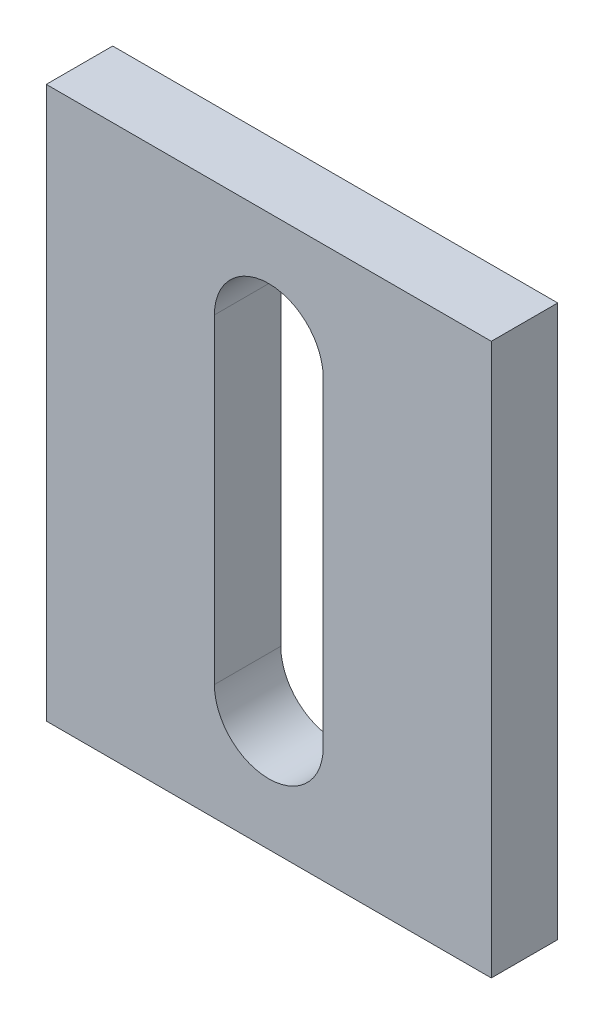
ISO-10303-21;
HEADER;
FILE_DESCRIPTION(('STEP AP214'),'2;1');
FILE_NAME('part.step','',(''),(''),'','','');
FILE_SCHEMA(('AUTOMOTIVE_DESIGN { 1 0 10303 214 1 1 1 1 }'));
ENDSEC;
DATA;
#1=APPLICATION_CONTEXT('core data for automotive mechanical design processes');
#2=APPLICATION_PROTOCOL_DEFINITION('international standard','automotive_design',2000,#1);
#3=PRODUCT_CONTEXT('',#1,'mechanical');
#4=PRODUCT('Part','Part','',(#3));
#5=PRODUCT_RELATED_PRODUCT_CATEGORY('part','',(#4));
#6=PRODUCT_DEFINITION_FORMATION('','',#4);
#7=PRODUCT_DEFINITION_CONTEXT('part definition',#1,'design');
#8=PRODUCT_DEFINITION('design','',#6,#7);
#9=PRODUCT_DEFINITION_SHAPE('','',#8);
#10=(LENGTH_UNIT() NAMED_UNIT(*) SI_UNIT(.MILLI.,.METRE.));
#11=(NAMED_UNIT(*) PLANE_ANGLE_UNIT() SI_UNIT($,.RADIAN.));
#12=(NAMED_UNIT(*) SI_UNIT($,.STERADIAN.) SOLID_ANGLE_UNIT());
#13=UNCERTAINTY_MEASURE_WITH_UNIT(LENGTH_MEASURE(1.E-05),#10,'distance_accuracy_value','');
#14=(GEOMETRIC_REPRESENTATION_CONTEXT(3) GLOBAL_UNCERTAINTY_ASSIGNED_CONTEXT((#13)) GLOBAL_UNIT_ASSIGNED_CONTEXT((#10,
#11,#12)) REPRESENTATION_CONTEXT('',''));
#15=CARTESIAN_POINT('',(0.,0.,0.));
#16=DIRECTION('',(0.,0.,1.));
#17=DIRECTION('',(1.,0.,0.));
#18=AXIS2_PLACEMENT_3D('',#15,#16,#17);
#19=CARTESIAN_POINT('',(31.8124195048387,0.,4.3));
#20=DIRECTION('',(1.,0.,0.));
#21=DIRECTION('',(0.,0.,-1.));
#22=AXIS2_PLACEMENT_3D('',#19,#20,#21);
#23=PLANE('',#22);
#24=DIRECTION('',(0.,-1.,0.));
#25=VECTOR('',#24,1.);
#26=CARTESIAN_POINT('',(31.8124195048387,0.,0.));
#27=LINE('',#26,#25);
#28=CARTESIAN_POINT('',(31.8124195048387,0.,0.));
#29=VERTEX_POINT('',#28);
#30=CARTESIAN_POINT('',(31.8124195048387,-35.7,0.));
#31=VERTEX_POINT('',#30);
#32=EDGE_CURVE('E145',#29,#31,#27,.T.);
#33=ORIENTED_EDGE('',*,*,#32,.F.);
#34=DIRECTION('',(0.,0.,-1.));
#35=VECTOR('',#34,1.);
#36=CARTESIAN_POINT('',(31.8124195048387,0.,4.3));
#37=LINE('',#36,#35);
#38=CARTESIAN_POINT('',(31.8124195048387,0.,4.3));
#39=VERTEX_POINT('',#38);
#40=EDGE_CURVE('E11',#39,#29,#37,.T.);
#41=ORIENTED_EDGE('',*,*,#40,.F.);
#42=DIRECTION('',(0.,-1.,0.));
#43=VECTOR('',#42,1.);
#44=CARTESIAN_POINT('',(31.8124195048387,0.,4.3));
#45=LINE('',#44,#43);
#46=CARTESIAN_POINT('',(31.8124195048387,-35.7,4.3));
#47=VERTEX_POINT('',#46);
#48=EDGE_CURVE('E125',#39,#47,#45,.T.);
#49=ORIENTED_EDGE('',*,*,#48,.T.);
#50=DIRECTION('',(0.,0.,-1.));
#51=VECTOR('',#50,1.);
#52=CARTESIAN_POINT('',(31.8124195048387,-35.7,4.3));
#53=LINE('',#52,#51);
#54=EDGE_CURVE('E87',#47,#31,#53,.T.);
#55=ORIENTED_EDGE('',*,*,#54,.T.);
#56=EDGE_LOOP('',(#33,#41,#49,#55));
#57=FACE_BOUND('',#56,.T.);
#58=ADVANCED_FACE('F33',(#57),#23,.T.);
#59=CARTESIAN_POINT('',(0.,0.,4.3));
#60=DIRECTION('',(0.,1.,0.));
#61=DIRECTION('',(0.,0.,1.));
#62=AXIS2_PLACEMENT_3D('',#59,#60,#61);
#63=PLANE('',#62);
#64=DIRECTION('',(1.,0.,0.));
#65=VECTOR('',#64,1.);
#66=CARTESIAN_POINT('',(0.,0.,0.));
#67=LINE('',#66,#65);
#68=CARTESIAN_POINT('',(3.,0.,0.));
#69=VERTEX_POINT('',#68);
#70=EDGE_CURVE('E115',#69,#29,#67,.T.);
#71=ORIENTED_EDGE('',*,*,#70,.F.);
#72=DIRECTION('',(0.,0.,-1.));
#73=VECTOR('',#72,1.);
#74=CARTESIAN_POINT('',(3.,0.,4.3));
#75=LINE('',#74,#73);
#76=CARTESIAN_POINT('',(3.,0.,4.3));
#77=VERTEX_POINT('',#76);
#78=EDGE_CURVE('E43',#77,#69,#75,.T.);
#79=ORIENTED_EDGE('',*,*,#78,.F.);
#80=DIRECTION('',(1.,0.,0.));
#81=VECTOR('',#80,1.);
#82=CARTESIAN_POINT('',(0.,0.,4.3));
#83=LINE('',#82,#81);
#84=EDGE_CURVE('E113',#77,#39,#83,.T.);
#85=ORIENTED_EDGE('',*,*,#84,.T.);
#86=ORIENTED_EDGE('',*,*,#40,.T.);
#87=EDGE_LOOP('',(#71,#79,#85,#86));
#88=FACE_BOUND('',#87,.T.);
#89=ADVANCED_FACE('F111',(#88),#63,.T.);
#90=CARTESIAN_POINT('',(3.,0.,4.3));
#91=DIRECTION('',(1.,0.,0.));
#92=DIRECTION('',(0.,0.,-1.));
#93=AXIS2_PLACEMENT_3D('',#90,#91,#92);
#94=PLANE('',#93);
#95=DIRECTION('',(0.,-1.,0.));
#96=VECTOR('',#95,1.);
#97=CARTESIAN_POINT('',(3.,0.,0.));
#98=LINE('',#97,#96);
#99=CARTESIAN_POINT('',(3.,-35.7,0.));
#100=VERTEX_POINT('',#99);
#101=EDGE_CURVE('E148',#69,#100,#98,.T.);
#102=ORIENTED_EDGE('',*,*,#101,.T.);
#103=DIRECTION('',(0.,0.,-1.));
#104=VECTOR('',#103,1.);
#105=CARTESIAN_POINT('',(3.,-35.7,4.3));
#106=LINE('',#105,#104);
#107=CARTESIAN_POINT('',(3.,-35.7,4.3));
#108=VERTEX_POINT('',#107);
#109=EDGE_CURVE('E118',#108,#100,#106,.T.);
#110=ORIENTED_EDGE('',*,*,#109,.F.);
#111=DIRECTION('',(0.,-1.,0.));
#112=VECTOR('',#111,1.);
#113=CARTESIAN_POINT('',(3.,0.,4.3));
#114=LINE('',#113,#112);
#115=EDGE_CURVE('E121',#77,#108,#114,.T.);
#116=ORIENTED_EDGE('',*,*,#115,.F.);
#117=ORIENTED_EDGE('',*,*,#78,.T.);
#118=EDGE_LOOP('',(#102,#110,#116,#117));
#119=FACE_BOUND('',#118,.T.);
#120=ADVANCED_FACE('F122',(#119),#94,.F.);
#121=CARTESIAN_POINT('',(17.4062097524194,-28.212407831461,4.3));
#122=DIRECTION('',(0.,0.,-1.));
#123=DIRECTION('',(-1.,0.,0.));
#124=AXIS2_PLACEMENT_3D('',#121,#122,#123);
#125=CYLINDRICAL_SURFACE('',#124,3.52216237368795);
#126=CARTESIAN_POINT('',(17.4062097524194,-28.212407831461,0.));
#127=DIRECTION('',(0.,0.,1.));
#128=DIRECTION('',(1.,0.,0.));
#129=AXIS2_PLACEMENT_3D('',#126,#127,#128);
#130=CIRCLE('',#129,3.52216237368795);
#131=CARTESIAN_POINT('',(13.8840473787314,-28.212407831461,0.));
#132=VERTEX_POINT('',#131);
#133=CARTESIAN_POINT('',(20.9283721261073,-28.212407831461,0.));
#134=VERTEX_POINT('',#133);
#135=EDGE_CURVE('E133',#132,#134,#130,.T.);
#136=ORIENTED_EDGE('',*,*,#135,.F.);
#137=DIRECTION('',(0.,0.,-1.));
#138=VECTOR('',#137,1.);
#139=CARTESIAN_POINT('',(13.8840473787314,-28.212407831461,4.3));
#140=LINE('',#139,#138);
#141=CARTESIAN_POINT('',(13.8840473787314,-28.212407831461,4.3));
#142=VERTEX_POINT('',#141);
#143=EDGE_CURVE('E37',#142,#132,#140,.T.);
#144=ORIENTED_EDGE('',*,*,#143,.F.);
#145=CARTESIAN_POINT('',(17.4062097524194,-28.212407831461,4.3));
#146=DIRECTION('',(0.,0.,1.));
#147=DIRECTION('',(1.,0.,0.));
#148=AXIS2_PLACEMENT_3D('',#145,#146,#147);
#149=CIRCLE('',#148,3.52216237368795);
#150=CARTESIAN_POINT('',(20.9283721261073,-28.212407831461,4.3));
#151=VERTEX_POINT('',#150);
#152=EDGE_CURVE('E151',#142,#151,#149,.T.);
#153=ORIENTED_EDGE('',*,*,#152,.T.);
#154=DIRECTION('',(0.,0.,-1.));
#155=VECTOR('',#154,1.);
#156=CARTESIAN_POINT('',(20.9283721261073,-28.212407831461,4.3));
#157=LINE('',#156,#155);
#158=EDGE_CURVE('E132',#151,#134,#157,.T.);
#159=ORIENTED_EDGE('',*,*,#158,.T.);
#160=EDGE_LOOP('',(#136,#144,#153,#159));
#161=FACE_BOUND('',#160,.T.);
#162=ADVANCED_FACE('F35',(#161),#125,.F.);
#163=CARTESIAN_POINT('',(13.8840473787314,0.,4.3));
#164=DIRECTION('',(1.,0.,0.));
#165=DIRECTION('',(0.,0.,-1.));
#166=AXIS2_PLACEMENT_3D('',#163,#164,#165);
#167=PLANE('',#166);
#168=DIRECTION('',(0.,-1.,0.));
#169=VECTOR('',#168,1.);
#170=CARTESIAN_POINT('',(13.8840473787314,0.,0.));
#171=LINE('',#170,#169);
#172=CARTESIAN_POINT('',(13.8840473787314,-7.48759216853905,0.));
#173=VERTEX_POINT('',#172);
#174=EDGE_CURVE('E136',#173,#132,#171,.T.);
#175=ORIENTED_EDGE('',*,*,#174,.F.);
#176=DIRECTION('',(0.,0.,-1.));
#177=VECTOR('',#176,1.);
#178=CARTESIAN_POINT('',(13.8840473787314,-7.48759216853905,4.3));
#179=LINE('',#178,#177);
#180=CARTESIAN_POINT('',(13.8840473787314,-7.48759216853905,4.3));
#181=VERTEX_POINT('',#180);
#182=EDGE_CURVE('E156',#181,#173,#179,.T.);
#183=ORIENTED_EDGE('',*,*,#182,.F.);
#184=DIRECTION('',(0.,-1.,0.));
#185=VECTOR('',#184,1.);
#186=CARTESIAN_POINT('',(13.8840473787314,0.,4.3));
#187=LINE('',#186,#185);
#188=EDGE_CURVE('E165',#181,#142,#187,.T.);
#189=ORIENTED_EDGE('',*,*,#188,.T.);
#190=ORIENTED_EDGE('',*,*,#143,.T.);
#191=EDGE_LOOP('',(#175,#183,#189,#190));
#192=FACE_BOUND('',#191,.T.);
#193=ADVANCED_FACE('F163',(#192),#167,.T.);
#194=CARTESIAN_POINT('',(17.4062097524194,-7.48759216853905,4.3));
#195=DIRECTION('',(0.,0.,-1.));
#196=DIRECTION('',(-1.,0.,0.));
#197=AXIS2_PLACEMENT_3D('',#194,#195,#196);
#198=CYLINDRICAL_SURFACE('',#197,3.52216237368795);
#199=CARTESIAN_POINT('',(17.4062097524194,-7.48759216853905,0.));
#200=DIRECTION('',(0.,0.,1.));
#201=DIRECTION('',(1.,0.,0.));
#202=AXIS2_PLACEMENT_3D('',#199,#200,#201);
#203=CIRCLE('',#202,3.52216237368795);
#204=CARTESIAN_POINT('',(20.9283721261073,-7.48759216853905,0.));
#205=VERTEX_POINT('',#204);
#206=EDGE_CURVE('E139',#205,#173,#203,.T.);
#207=ORIENTED_EDGE('',*,*,#206,.F.);
#208=DIRECTION('',(0.,0.,-1.));
#209=VECTOR('',#208,1.);
#210=CARTESIAN_POINT('',(20.9283721261073,-7.48759216853905,4.3));
#211=LINE('',#210,#209);
#212=CARTESIAN_POINT('',(20.9283721261073,-7.48759216853905,4.3));
#213=VERTEX_POINT('',#212);
#214=EDGE_CURVE('E155',#213,#205,#211,.T.);
#215=ORIENTED_EDGE('',*,*,#214,.F.);
#216=CARTESIAN_POINT('',(17.4062097524194,-7.48759216853905,4.3));
#217=DIRECTION('',(0.,0.,1.));
#218=DIRECTION('',(1.,0.,0.));
#219=AXIS2_PLACEMENT_3D('',#216,#217,#218);
#220=CIRCLE('',#219,3.52216237368795);
#221=EDGE_CURVE('E173',#213,#181,#220,.T.);
#222=ORIENTED_EDGE('',*,*,#221,.T.);
#223=ORIENTED_EDGE('',*,*,#182,.T.);
#224=EDGE_LOOP('',(#207,#215,#222,#223));
#225=FACE_BOUND('',#224,.T.);
#226=ADVANCED_FACE('F170',(#225),#198,.F.);
#227=CARTESIAN_POINT('',(20.9283721261073,0.,4.3));
#228=DIRECTION('',(1.,0.,0.));
#229=DIRECTION('',(0.,0.,-1.));
#230=AXIS2_PLACEMENT_3D('',#227,#228,#229);
#231=PLANE('',#230);
#232=DIRECTION('',(0.,-1.,0.));
#233=VECTOR('',#232,1.);
#234=CARTESIAN_POINT('',(20.9283721261073,0.,0.));
#235=LINE('',#234,#233);
#236=EDGE_CURVE('E142',#205,#134,#235,.T.);
#237=ORIENTED_EDGE('',*,*,#236,.T.);
#238=ORIENTED_EDGE('',*,*,#158,.F.);
#239=DIRECTION('',(0.,-1.,0.));
#240=VECTOR('',#239,1.);
#241=CARTESIAN_POINT('',(20.9283721261073,0.,4.3));
#242=LINE('',#241,#240);
#243=EDGE_CURVE('E127',#213,#151,#242,.T.);
#244=ORIENTED_EDGE('',*,*,#243,.F.);
#245=ORIENTED_EDGE('',*,*,#214,.T.);
#246=EDGE_LOOP('',(#237,#238,#244,#245));
#247=FACE_BOUND('',#246,.T.);
#248=ADVANCED_FACE('F175',(#247),#231,.F.);
#249=CARTESIAN_POINT('',(0.,-35.7,4.3));
#250=DIRECTION('',(0.,1.,0.));
#251=DIRECTION('',(0.,0.,1.));
#252=AXIS2_PLACEMENT_3D('',#249,#250,#251);
#253=PLANE('',#252);
#254=DIRECTION('',(1.,0.,0.));
#255=VECTOR('',#254,1.);
#256=CARTESIAN_POINT('',(0.,-35.7,0.));
#257=LINE('',#256,#255);
#258=EDGE_CURVE('E80',#100,#31,#257,.T.);
#259=ORIENTED_EDGE('',*,*,#258,.T.);
#260=ORIENTED_EDGE('',*,*,#54,.F.);
#261=DIRECTION('',(1.,0.,0.));
#262=VECTOR('',#261,1.);
#263=CARTESIAN_POINT('',(0.,-35.7,4.3));
#264=LINE('',#263,#262);
#265=EDGE_CURVE('E52',#108,#47,#264,.T.);
#266=ORIENTED_EDGE('',*,*,#265,.F.);
#267=ORIENTED_EDGE('',*,*,#109,.T.);
#268=EDGE_LOOP('',(#259,#260,#266,#267));
#269=FACE_BOUND('',#268,.T.);
#270=ADVANCED_FACE('F181',(#269),#253,.F.);
#271=CARTESIAN_POINT('',(0.,0.,4.3));
#272=DIRECTION('',(0.,0.,1.));
#273=DIRECTION('',(1.,0.,0.));
#274=AXIS2_PLACEMENT_3D('',#271,#272,#273);
#275=PLANE('',#274);
#276=ORIENTED_EDGE('',*,*,#152,.F.);
#277=ORIENTED_EDGE('',*,*,#188,.F.);
#278=ORIENTED_EDGE('',*,*,#221,.F.);
#279=ORIENTED_EDGE('',*,*,#243,.T.);
#280=EDGE_LOOP('',(#276,#277,#278,#279));
#281=FACE_BOUND('',#280,.T.);
#282=ORIENTED_EDGE('',*,*,#48,.F.);
#283=ORIENTED_EDGE('',*,*,#84,.F.);
#284=ORIENTED_EDGE('',*,*,#115,.T.);
#285=ORIENTED_EDGE('',*,*,#265,.T.);
#286=EDGE_LOOP('',(#282,#283,#284,#285));
#287=FACE_BOUND('',#286,.T.);
#288=ADVANCED_FACE('F124',(#281,#287),#275,.T.);
#289=CARTESIAN_POINT('',(0.,0.,0.));
#290=DIRECTION('',(0.,0.,1.));
#291=DIRECTION('',(1.,0.,0.));
#292=AXIS2_PLACEMENT_3D('',#289,#290,#291);
#293=PLANE('',#292);
#294=ORIENTED_EDGE('',*,*,#135,.T.);
#295=ORIENTED_EDGE('',*,*,#236,.F.);
#296=ORIENTED_EDGE('',*,*,#206,.T.);
#297=ORIENTED_EDGE('',*,*,#174,.T.);
#298=EDGE_LOOP('',(#294,#295,#296,#297));
#299=FACE_BOUND('',#298,.T.);
#300=ORIENTED_EDGE('',*,*,#32,.T.);
#301=ORIENTED_EDGE('',*,*,#258,.F.);
#302=ORIENTED_EDGE('',*,*,#101,.F.);
#303=ORIENTED_EDGE('',*,*,#70,.T.);
#304=EDGE_LOOP('',(#300,#301,#302,#303));
#305=FACE_BOUND('',#304,.T.);
#306=ADVANCED_FACE('F169',(#299,#305),#293,.F.);
#307=CLOSED_SHELL('',(#58,#89,#120,#162,#193,#226,#248,#270,#288,#306));
#308=MANIFOLD_SOLID_BREP('B2',#307);
#309=ADVANCED_BREP_SHAPE_REPRESENTATION('',(#18,#308),#14);
#310=SHAPE_DEFINITION_REPRESENTATION(#9,#309);
ENDSEC;
END-ISO-10303-21;
